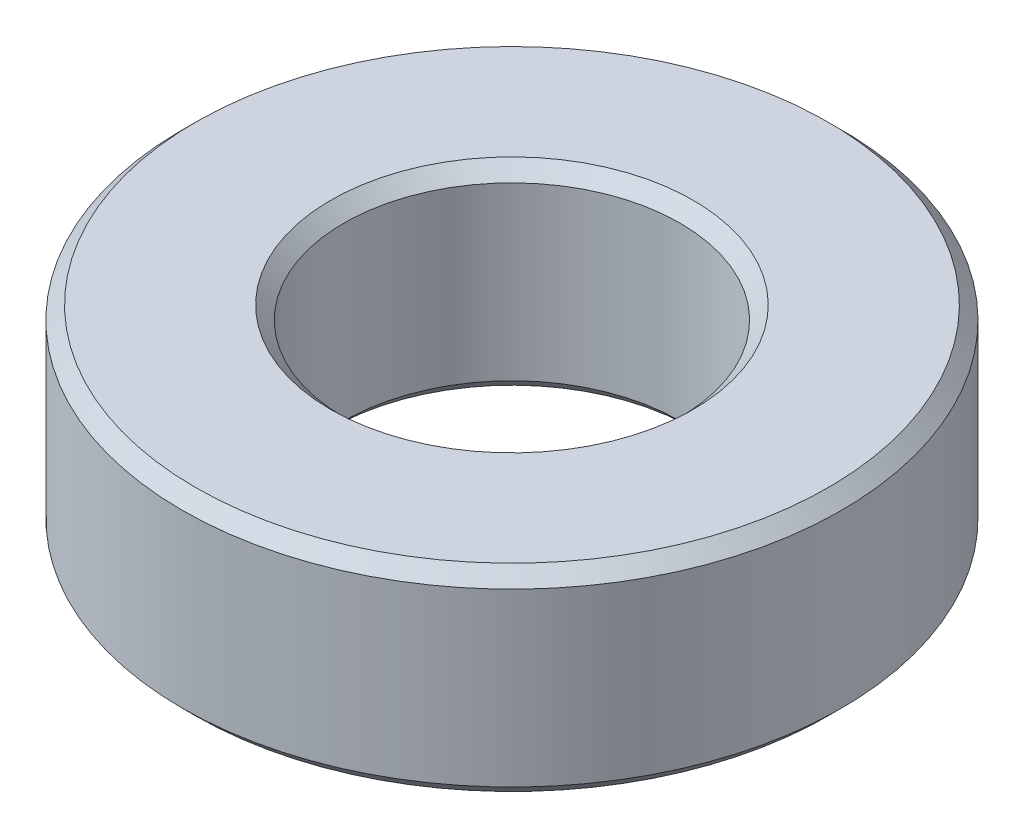
ISO-10303-21;
HEADER;
FILE_DESCRIPTION(('STEP AP214'),'2;1');
FILE_NAME('part.step','',(''),(''),'','','');
FILE_SCHEMA(('AUTOMOTIVE_DESIGN { 1 0 10303 214 1 1 1 1 }'));
ENDSEC;
DATA;
#1=APPLICATION_CONTEXT('core data for automotive mechanical design processes');
#2=APPLICATION_PROTOCOL_DEFINITION('international standard','automotive_design',2000,#1);
#3=PRODUCT_CONTEXT('',#1,'mechanical');
#4=PRODUCT('Part','Part','',(#3));
#5=PRODUCT_RELATED_PRODUCT_CATEGORY('part','',(#4));
#6=PRODUCT_DEFINITION_FORMATION('','',#4);
#7=PRODUCT_DEFINITION_CONTEXT('part definition',#1,'design');
#8=PRODUCT_DEFINITION('design','',#6,#7);
#9=PRODUCT_DEFINITION_SHAPE('','',#8);
#10=(LENGTH_UNIT() NAMED_UNIT(*) SI_UNIT(.MILLI.,.METRE.));
#11=(NAMED_UNIT(*) PLANE_ANGLE_UNIT() SI_UNIT($,.RADIAN.));
#12=(NAMED_UNIT(*) SI_UNIT($,.STERADIAN.) SOLID_ANGLE_UNIT());
#13=UNCERTAINTY_MEASURE_WITH_UNIT(LENGTH_MEASURE(1.E-05),#10,'distance_accuracy_value','');
#14=(GEOMETRIC_REPRESENTATION_CONTEXT(3) GLOBAL_UNCERTAINTY_ASSIGNED_CONTEXT((#13)) GLOBAL_UNIT_ASSIGNED_CONTEXT((#10,
#11,#12)) REPRESENTATION_CONTEXT('',''));
#15=CARTESIAN_POINT('',(0.,0.,0.));
#16=DIRECTION('',(0.,0.,1.));
#17=DIRECTION('',(1.,0.,0.));
#18=AXIS2_PLACEMENT_3D('',#15,#16,#17);
#19=CARTESIAN_POINT('',(0.,1.5,-2.75));
#20=DIRECTION('',(0.,-1.,0.));
#21=DIRECTION('',(0.,0.,-1.));
#22=AXIS2_PLACEMENT_3D('',#19,#20,#21);
#23=PLANE('',#22);
#24=CARTESIAN_POINT('',(0.,1.5,0.));
#25=DIRECTION('',(0.,1.,0.));
#26=DIRECTION('',(0.,0.,1.));
#27=AXIS2_PLACEMENT_3D('',#24,#25,#26);
#28=CIRCLE('',#27,2.75);
#29=CARTESIAN_POINT('',(0.,1.5,2.75));
#30=VERTEX_POINT('',#29);
#31=EDGE_CURVE('E65',#30,#30,#28,.T.);
#32=ORIENTED_EDGE('',*,*,#31,.F.);
#33=EDGE_LOOP('',(#32));
#34=FACE_BOUND('',#33,.T.);
#35=CARTESIAN_POINT('',(0.,1.5,0.));
#36=DIRECTION('',(0.,1.,0.));
#37=DIRECTION('',(0.,0.,1.));
#38=AXIS2_PLACEMENT_3D('',#35,#36,#37);
#39=CIRCLE('',#38,4.8);
#40=CARTESIAN_POINT('',(0.,1.5,4.8));
#41=VERTEX_POINT('',#40);
#42=EDGE_CURVE('E10',#41,#41,#39,.T.);
#43=ORIENTED_EDGE('',*,*,#42,.T.);
#44=EDGE_LOOP('',(#43));
#45=FACE_BOUND('',#44,.T.);
#46=ADVANCED_FACE('F37',(#34,#45),#23,.F.);
#47=CARTESIAN_POINT('',(0.,1.3,0.));
#48=DIRECTION('',(0.,-1.,0.));
#49=DIRECTION('',(0.,0.,-1.));
#50=AXIS2_PLACEMENT_3D('',#47,#48,#49);
#51=CONICAL_SURFACE('',#50,5.,0.785398163397452);
#52=ORIENTED_EDGE('',*,*,#42,.F.);
#53=EDGE_LOOP('',(#52));
#54=FACE_BOUND('',#53,.T.);
#55=CARTESIAN_POINT('',(0.,1.3,0.));
#56=DIRECTION('',(0.,1.,0.));
#57=DIRECTION('',(0.,0.,1.));
#58=AXIS2_PLACEMENT_3D('',#55,#56,#57);
#59=CIRCLE('',#58,5.);
#60=CARTESIAN_POINT('',(0.,1.3,5.));
#61=VERTEX_POINT('',#60);
#62=EDGE_CURVE('E43',#61,#61,#59,.T.);
#63=ORIENTED_EDGE('',*,*,#62,.T.);
#64=EDGE_LOOP('',(#63));
#65=FACE_BOUND('',#64,.T.);
#66=ADVANCED_FACE('F72',(#54,#65),#51,.T.);
#67=CARTESIAN_POINT('',(0.,2.13387096774193,0.));
#68=DIRECTION('',(0.,1.,0.));
#69=DIRECTION('',(0.,0.,1.));
#70=AXIS2_PLACEMENT_3D('',#67,#68,#69);
#71=CYLINDRICAL_SURFACE('',#70,5.);
#72=ORIENTED_EDGE('',*,*,#62,.F.);
#73=EDGE_LOOP('',(#72));
#74=FACE_BOUND('',#73,.T.);
#75=CARTESIAN_POINT('',(0.,-1.3,0.));
#76=DIRECTION('',(0.,1.,0.));
#77=DIRECTION('',(0.,0.,1.));
#78=AXIS2_PLACEMENT_3D('',#75,#76,#77);
#79=CIRCLE('',#78,5.);
#80=CARTESIAN_POINT('',(0.,-1.3,5.));
#81=VERTEX_POINT('',#80);
#82=EDGE_CURVE('E47',#81,#81,#79,.T.);
#83=ORIENTED_EDGE('',*,*,#82,.T.);
#84=EDGE_LOOP('',(#83));
#85=FACE_BOUND('',#84,.T.);
#86=ADVANCED_FACE('F76',(#74,#85),#71,.T.);
#87=CARTESIAN_POINT('',(0.,-1.5,0.));
#88=DIRECTION('',(0.,1.,0.));
#89=DIRECTION('',(0.,0.,1.));
#90=AXIS2_PLACEMENT_3D('',#87,#88,#89);
#91=CONICAL_SURFACE('',#90,4.8,0.785398163397448);
#92=ORIENTED_EDGE('',*,*,#82,.F.);
#93=EDGE_LOOP('',(#92));
#94=FACE_BOUND('',#93,.T.);
#95=CARTESIAN_POINT('',(0.,-1.5,0.));
#96=DIRECTION('',(0.,1.,0.));
#97=DIRECTION('',(0.,0.,1.));
#98=AXIS2_PLACEMENT_3D('',#95,#96,#97);
#99=CIRCLE('',#98,4.8);
#100=CARTESIAN_POINT('',(0.,-1.5,4.8));
#101=VERTEX_POINT('',#100);
#102=EDGE_CURVE('E51',#101,#101,#99,.T.);
#103=ORIENTED_EDGE('',*,*,#102,.T.);
#104=EDGE_LOOP('',(#103));
#105=FACE_BOUND('',#104,.T.);
#106=ADVANCED_FACE('F81',(#94,#105),#91,.T.);
#107=CARTESIAN_POINT('',(0.,-1.5,-2.75));
#108=DIRECTION('',(0.,1.,0.));
#109=DIRECTION('',(0.,0.,1.));
#110=AXIS2_PLACEMENT_3D('',#107,#108,#109);
#111=PLANE('',#110);
#112=ORIENTED_EDGE('',*,*,#102,.F.);
#113=EDGE_LOOP('',(#112));
#114=FACE_BOUND('',#113,.T.);
#115=CARTESIAN_POINT('',(0.,-1.5,0.));
#116=DIRECTION('',(0.,1.,0.));
#117=DIRECTION('',(0.,0.,1.));
#118=AXIS2_PLACEMENT_3D('',#115,#116,#117);
#119=CIRCLE('',#118,2.75);
#120=CARTESIAN_POINT('',(0.,-1.5,2.75));
#121=VERTEX_POINT('',#120);
#122=EDGE_CURVE('E56',#121,#121,#119,.T.);
#123=ORIENTED_EDGE('',*,*,#122,.T.);
#124=EDGE_LOOP('',(#123));
#125=FACE_BOUND('',#124,.T.);
#126=ADVANCED_FACE('F87',(#114,#125),#111,.F.);
#127=CARTESIAN_POINT('',(0.,-1.3,0.));
#128=DIRECTION('',(0.,-1.,0.));
#129=DIRECTION('',(0.,0.,-1.));
#130=AXIS2_PLACEMENT_3D('',#127,#128,#129);
#131=CONICAL_SURFACE('',#130,2.55,0.785398163397448);
#132=ORIENTED_EDGE('',*,*,#122,.F.);
#133=EDGE_LOOP('',(#132));
#134=FACE_BOUND('',#133,.T.);
#135=CARTESIAN_POINT('',(0.,-1.3,0.));
#136=DIRECTION('',(0.,1.,0.));
#137=DIRECTION('',(0.,0.,1.));
#138=AXIS2_PLACEMENT_3D('',#135,#136,#137);
#139=CIRCLE('',#138,2.55);
#140=CARTESIAN_POINT('',(0.,-1.3,2.55));
#141=VERTEX_POINT('',#140);
#142=EDGE_CURVE('E59',#141,#141,#139,.T.);
#143=ORIENTED_EDGE('',*,*,#142,.T.);
#144=EDGE_LOOP('',(#143));
#145=FACE_BOUND('',#144,.T.);
#146=ADVANCED_FACE('F91',(#134,#145),#131,.F.);
#147=CARTESIAN_POINT('',(0.,2.13387096774193,0.));
#148=DIRECTION('',(0.,1.,0.));
#149=DIRECTION('',(0.,0.,1.));
#150=AXIS2_PLACEMENT_3D('',#147,#148,#149);
#151=CYLINDRICAL_SURFACE('',#150,2.55);
#152=ORIENTED_EDGE('',*,*,#142,.F.);
#153=EDGE_LOOP('',(#152));
#154=FACE_BOUND('',#153,.T.);
#155=CARTESIAN_POINT('',(0.,1.3,0.));
#156=DIRECTION('',(0.,1.,0.));
#157=DIRECTION('',(0.,0.,1.));
#158=AXIS2_PLACEMENT_3D('',#155,#156,#157);
#159=CIRCLE('',#158,2.55);
#160=CARTESIAN_POINT('',(0.,1.3,2.55));
#161=VERTEX_POINT('',#160);
#162=EDGE_CURVE('E62',#161,#161,#159,.T.);
#163=ORIENTED_EDGE('',*,*,#162,.T.);
#164=EDGE_LOOP('',(#163));
#165=FACE_BOUND('',#164,.T.);
#166=ADVANCED_FACE('F95',(#154,#165),#151,.F.);
#167=CARTESIAN_POINT('',(0.,1.5,0.));
#168=DIRECTION('',(0.,1.,0.));
#169=DIRECTION('',(0.,0.,1.));
#170=AXIS2_PLACEMENT_3D('',#167,#168,#169);
#171=CONICAL_SURFACE('',#170,2.75,0.785398163397448);
#172=ORIENTED_EDGE('',*,*,#162,.F.);
#173=EDGE_LOOP('',(#172));
#174=FACE_BOUND('',#173,.T.);
#175=ORIENTED_EDGE('',*,*,#31,.T.);
#176=EDGE_LOOP('',(#175));
#177=FACE_BOUND('',#176,.T.);
#178=ADVANCED_FACE('F69',(#174,#177),#171,.F.);
#179=CLOSED_SHELL('',(#46,#66,#86,#106,#126,#146,#166,#178));
#180=MANIFOLD_SOLID_BREP('B2',#179);
#181=ADVANCED_BREP_SHAPE_REPRESENTATION('',(#18,#180),#14);
#182=SHAPE_DEFINITION_REPRESENTATION(#9,#181);
ENDSEC;
END-ISO-10303-21;
